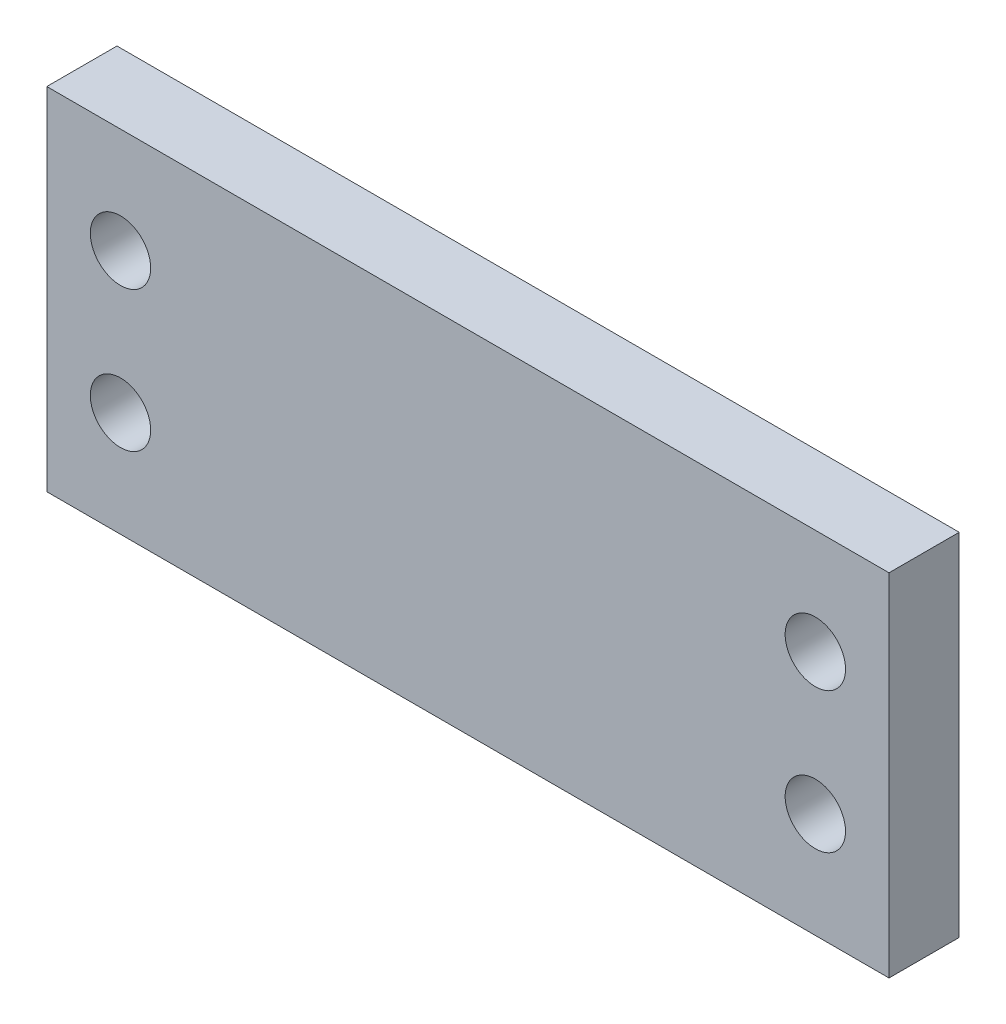
ISO-10303-21;
HEADER;
FILE_DESCRIPTION(('STEP AP214'),'2;1');
FILE_NAME('part.step','',(''),(''),'','','');
FILE_SCHEMA(('AUTOMOTIVE_DESIGN { 1 0 10303 214 1 1 1 1 }'));
ENDSEC;
DATA;
#1=APPLICATION_CONTEXT('core data for automotive mechanical design processes');
#2=APPLICATION_PROTOCOL_DEFINITION('international standard','automotive_design',2000,#1);
#3=PRODUCT_CONTEXT('',#1,'mechanical');
#4=PRODUCT('Part','Part','',(#3));
#5=PRODUCT_RELATED_PRODUCT_CATEGORY('part','',(#4));
#6=PRODUCT_DEFINITION_FORMATION('','',#4);
#7=PRODUCT_DEFINITION_CONTEXT('part definition',#1,'design');
#8=PRODUCT_DEFINITION('design','',#6,#7);
#9=PRODUCT_DEFINITION_SHAPE('','',#8);
#10=(LENGTH_UNIT() NAMED_UNIT(*) SI_UNIT(.MILLI.,.METRE.));
#11=(NAMED_UNIT(*) PLANE_ANGLE_UNIT() SI_UNIT($,.RADIAN.));
#12=(NAMED_UNIT(*) SI_UNIT($,.STERADIAN.) SOLID_ANGLE_UNIT());
#13=UNCERTAINTY_MEASURE_WITH_UNIT(LENGTH_MEASURE(1.E-05),#10,'distance_accuracy_value','');
#14=(GEOMETRIC_REPRESENTATION_CONTEXT(3) GLOBAL_UNCERTAINTY_ASSIGNED_CONTEXT((#13)) GLOBAL_UNIT_ASSIGNED_CONTEXT((#10,
#11,#12)) REPRESENTATION_CONTEXT('',''));
#15=CARTESIAN_POINT('',(0.,0.,0.));
#16=DIRECTION('',(0.,0.,1.));
#17=DIRECTION('',(1.,0.,0.));
#18=AXIS2_PLACEMENT_3D('',#15,#16,#17);
#19=CARTESIAN_POINT('',(30.,12.5,5.));
#20=DIRECTION('',(-1.,0.,0.));
#21=DIRECTION('',(0.,0.,1.));
#22=AXIS2_PLACEMENT_3D('',#19,#20,#21);
#23=PLANE('',#22);
#24=DIRECTION('',(0.,1.,0.));
#25=VECTOR('',#24,1.);
#26=CARTESIAN_POINT('',(30.,12.5,0.));
#27=LINE('',#26,#25);
#28=CARTESIAN_POINT('',(30.,-12.5,0.));
#29=VERTEX_POINT('',#28);
#30=CARTESIAN_POINT('',(30.,12.5,0.));
#31=VERTEX_POINT('',#30);
#32=EDGE_CURVE('E101',#29,#31,#27,.T.);
#33=ORIENTED_EDGE('',*,*,#32,.T.);
#34=DIRECTION('',(0.,0.,-1.));
#35=VECTOR('',#34,1.);
#36=CARTESIAN_POINT('',(30.,12.5,5.));
#37=LINE('',#36,#35);
#38=CARTESIAN_POINT('',(30.,12.5,5.));
#39=VERTEX_POINT('',#38);
#40=EDGE_CURVE('E11',#39,#31,#37,.T.);
#41=ORIENTED_EDGE('',*,*,#40,.F.);
#42=DIRECTION('',(0.,1.,0.));
#43=VECTOR('',#42,1.);
#44=CARTESIAN_POINT('',(30.,12.5,5.));
#45=LINE('',#44,#43);
#46=CARTESIAN_POINT('',(30.,-12.5,5.));
#47=VERTEX_POINT('',#46);
#48=EDGE_CURVE('E88',#47,#39,#45,.T.);
#49=ORIENTED_EDGE('',*,*,#48,.F.);
#50=DIRECTION('',(0.,0.,-1.));
#51=VECTOR('',#50,1.);
#52=CARTESIAN_POINT('',(30.,-12.5,5.));
#53=LINE('',#52,#51);
#54=EDGE_CURVE('E97',#47,#29,#53,.T.);
#55=ORIENTED_EDGE('',*,*,#54,.T.);
#56=EDGE_LOOP('',(#33,#41,#49,#55));
#57=FACE_BOUND('',#56,.T.);
#58=ADVANCED_FACE('F35',(#57),#23,.F.);
#59=CARTESIAN_POINT('',(-30.,12.5,5.));
#60=DIRECTION('',(0.,-1.,0.));
#61=DIRECTION('',(0.,0.,-1.));
#62=AXIS2_PLACEMENT_3D('',#59,#60,#61);
#63=PLANE('',#62);
#64=DIRECTION('',(-1.,0.,0.));
#65=VECTOR('',#64,1.);
#66=CARTESIAN_POINT('',(-30.,12.5,0.));
#67=LINE('',#66,#65);
#68=CARTESIAN_POINT('',(-30.,12.5,0.));
#69=VERTEX_POINT('',#68);
#70=EDGE_CURVE('E92',#31,#69,#67,.T.);
#71=ORIENTED_EDGE('',*,*,#70,.T.);
#72=DIRECTION('',(0.,0.,-1.));
#73=VECTOR('',#72,1.);
#74=CARTESIAN_POINT('',(-30.,12.5,5.));
#75=LINE('',#74,#73);
#76=CARTESIAN_POINT('',(-30.,12.5,5.));
#77=VERTEX_POINT('',#76);
#78=EDGE_CURVE('E44',#77,#69,#75,.T.);
#79=ORIENTED_EDGE('',*,*,#78,.F.);
#80=DIRECTION('',(-1.,0.,0.));
#81=VECTOR('',#80,1.);
#82=CARTESIAN_POINT('',(-30.,12.5,5.));
#83=LINE('',#82,#81);
#84=EDGE_CURVE('E83',#39,#77,#83,.T.);
#85=ORIENTED_EDGE('',*,*,#84,.F.);
#86=ORIENTED_EDGE('',*,*,#40,.T.);
#87=EDGE_LOOP('',(#71,#79,#85,#86));
#88=FACE_BOUND('',#87,.T.);
#89=ADVANCED_FACE('F91',(#88),#63,.F.);
#90=CARTESIAN_POINT('',(-30.,12.5,5.));
#91=DIRECTION('',(1.,0.,0.));
#92=DIRECTION('',(0.,1.,0.));
#93=AXIS2_PLACEMENT_3D('',#90,#91,#92);
#94=PLANE('',#93);
#95=DIRECTION('',(0.,-1.,0.));
#96=VECTOR('',#95,1.);
#97=CARTESIAN_POINT('',(-30.,12.5,0.));
#98=LINE('',#97,#96);
#99=CARTESIAN_POINT('',(-30.,-12.5,0.));
#100=VERTEX_POINT('',#99);
#101=EDGE_CURVE('E70',#69,#100,#98,.T.);
#102=ORIENTED_EDGE('',*,*,#101,.T.);
#103=DIRECTION('',(0.,0.,-1.));
#104=VECTOR('',#103,1.);
#105=CARTESIAN_POINT('',(-30.,-12.5,5.));
#106=LINE('',#105,#104);
#107=CARTESIAN_POINT('',(-30.,-12.5,5.));
#108=VERTEX_POINT('',#107);
#109=EDGE_CURVE('E93',#108,#100,#106,.T.);
#110=ORIENTED_EDGE('',*,*,#109,.F.);
#111=DIRECTION('',(0.,-1.,0.));
#112=VECTOR('',#111,1.);
#113=CARTESIAN_POINT('',(-30.,12.5,5.));
#114=LINE('',#113,#112);
#115=EDGE_CURVE('E86',#77,#108,#114,.T.);
#116=ORIENTED_EDGE('',*,*,#115,.F.);
#117=ORIENTED_EDGE('',*,*,#78,.T.);
#118=EDGE_LOOP('',(#102,#110,#116,#117));
#119=FACE_BOUND('',#118,.T.);
#120=ADVANCED_FACE('F95',(#119),#94,.F.);
#121=CARTESIAN_POINT('',(-30.,-12.5,5.));
#122=DIRECTION('',(0.,1.,0.));
#123=DIRECTION('',(0.,0.,1.));
#124=AXIS2_PLACEMENT_3D('',#121,#122,#123);
#125=PLANE('',#124);
#126=DIRECTION('',(1.,0.,0.));
#127=VECTOR('',#126,1.);
#128=CARTESIAN_POINT('',(-30.,-12.5,0.));
#129=LINE('',#128,#127);
#130=EDGE_CURVE('E76',#100,#29,#129,.T.);
#131=ORIENTED_EDGE('',*,*,#130,.T.);
#132=ORIENTED_EDGE('',*,*,#54,.F.);
#133=DIRECTION('',(1.,0.,0.));
#134=VECTOR('',#133,1.);
#135=CARTESIAN_POINT('',(-30.,-12.5,5.));
#136=LINE('',#135,#134);
#137=EDGE_CURVE('E53',#108,#47,#136,.T.);
#138=ORIENTED_EDGE('',*,*,#137,.F.);
#139=ORIENTED_EDGE('',*,*,#109,.T.);
#140=EDGE_LOOP('',(#131,#132,#138,#139));
#141=FACE_BOUND('',#140,.T.);
#142=ADVANCED_FACE('F153',(#141),#125,.F.);
#143=CARTESIAN_POINT('',(0.,0.,5.));
#144=DIRECTION('',(0.,0.,1.));
#145=DIRECTION('',(1.,0.,0.));
#146=AXIS2_PLACEMENT_3D('',#143,#144,#145);
#147=PLANE('',#146);
#148=CARTESIAN_POINT('',(-24.75,-4.99999999999999,5.));
#149=DIRECTION('',(0.,0.,1.));
#150=DIRECTION('',(1.,0.,0.));
#151=AXIS2_PLACEMENT_3D('',#148,#149,#150);
#152=CIRCLE('',#151,2.14999999999858);
#153=CARTESIAN_POINT('',(-22.6000000000014,-4.99999999999999,5.));
#154=VERTEX_POINT('',#153);
#155=EDGE_CURVE('E217',#154,#154,#152,.T.);
#156=ORIENTED_EDGE('',*,*,#155,.F.);
#157=EDGE_LOOP('',(#156));
#158=FACE_BOUND('',#157,.T.);
#159=CARTESIAN_POINT('',(24.75,5.00000000000001,5.));
#160=DIRECTION('',(0.,0.,1.));
#161=DIRECTION('',(1.,0.,0.));
#162=AXIS2_PLACEMENT_3D('',#159,#160,#161);
#163=CIRCLE('',#162,2.14999999999858);
#164=CARTESIAN_POINT('',(26.8999999999986,5.00000000000001,5.));
#165=VERTEX_POINT('',#164);
#166=EDGE_CURVE('E214',#165,#165,#163,.T.);
#167=ORIENTED_EDGE('',*,*,#166,.F.);
#168=EDGE_LOOP('',(#167));
#169=FACE_BOUND('',#168,.T.);
#170=CARTESIAN_POINT('',(24.75,-4.99999999999999,5.));
#171=DIRECTION('',(0.,0.,1.));
#172=DIRECTION('',(1.,0.,0.));
#173=AXIS2_PLACEMENT_3D('',#170,#171,#172);
#174=CIRCLE('',#173,2.14999999999858);
#175=CARTESIAN_POINT('',(26.8999999999986,-4.99999999999999,5.));
#176=VERTEX_POINT('',#175);
#177=EDGE_CURVE('E207',#176,#176,#174,.T.);
#178=ORIENTED_EDGE('',*,*,#177,.F.);
#179=EDGE_LOOP('',(#178));
#180=FACE_BOUND('',#179,.T.);
#181=CARTESIAN_POINT('',(-24.75,5.00000000000001,5.));
#182=DIRECTION('',(0.,0.,1.));
#183=DIRECTION('',(1.,0.,0.));
#184=AXIS2_PLACEMENT_3D('',#181,#182,#183);
#185=CIRCLE('',#184,2.14999999999823);
#186=CARTESIAN_POINT('',(-22.6000000000018,5.00000000000001,5.));
#187=VERTEX_POINT('',#186);
#188=EDGE_CURVE('E113',#187,#187,#185,.T.);
#189=ORIENTED_EDGE('',*,*,#188,.F.);
#190=EDGE_LOOP('',(#189));
#191=FACE_BOUND('',#190,.T.);
#192=ORIENTED_EDGE('',*,*,#48,.T.);
#193=ORIENTED_EDGE('',*,*,#84,.T.);
#194=ORIENTED_EDGE('',*,*,#115,.T.);
#195=ORIENTED_EDGE('',*,*,#137,.T.);
#196=EDGE_LOOP('',(#192,#193,#194,#195));
#197=FACE_BOUND('',#196,.T.);
#198=ADVANCED_FACE('F84',(#158,#169,#180,#191,#197),#147,.T.);
#199=CARTESIAN_POINT('',(0.,0.,0.));
#200=DIRECTION('',(0.,0.,1.));
#201=DIRECTION('',(1.,0.,0.));
#202=AXIS2_PLACEMENT_3D('',#199,#200,#201);
#203=PLANE('',#202);
#204=CARTESIAN_POINT('',(-24.75,-4.99999999999999,0.));
#205=DIRECTION('',(0.,0.,1.));
#206=DIRECTION('',(1.,0.,0.));
#207=AXIS2_PLACEMENT_3D('',#204,#205,#206);
#208=CIRCLE('',#207,2.14999999999858);
#209=CARTESIAN_POINT('',(-22.6000000000014,-4.99999999999999,0.));
#210=VERTEX_POINT('',#209);
#211=EDGE_CURVE('E38',#210,#210,#208,.T.);
#212=ORIENTED_EDGE('',*,*,#211,.T.);
#213=EDGE_LOOP('',(#212));
#214=FACE_BOUND('',#213,.T.);
#215=CARTESIAN_POINT('',(24.75,5.00000000000001,0.));
#216=DIRECTION('',(0.,0.,1.));
#217=DIRECTION('',(1.,0.,0.));
#218=AXIS2_PLACEMENT_3D('',#215,#216,#217);
#219=CIRCLE('',#218,2.14999999999858);
#220=CARTESIAN_POINT('',(26.8999999999986,5.00000000000001,0.));
#221=VERTEX_POINT('',#220);
#222=EDGE_CURVE('E115',#221,#221,#219,.T.);
#223=ORIENTED_EDGE('',*,*,#222,.T.);
#224=EDGE_LOOP('',(#223));
#225=FACE_BOUND('',#224,.T.);
#226=CARTESIAN_POINT('',(24.75,-4.99999999999999,0.));
#227=DIRECTION('',(0.,0.,1.));
#228=DIRECTION('',(1.,0.,0.));
#229=AXIS2_PLACEMENT_3D('',#226,#227,#228);
#230=CIRCLE('',#229,2.14999999999858);
#231=CARTESIAN_POINT('',(26.8999999999986,-4.99999999999999,0.));
#232=VERTEX_POINT('',#231);
#233=EDGE_CURVE('E112',#232,#232,#230,.T.);
#234=ORIENTED_EDGE('',*,*,#233,.T.);
#235=EDGE_LOOP('',(#234));
#236=FACE_BOUND('',#235,.T.);
#237=CARTESIAN_POINT('',(-24.75,5.00000000000001,0.));
#238=DIRECTION('',(0.,0.,1.));
#239=DIRECTION('',(1.,0.,0.));
#240=AXIS2_PLACEMENT_3D('',#237,#238,#239);
#241=CIRCLE('',#240,2.14999999999823);
#242=CARTESIAN_POINT('',(-22.6000000000018,5.00000000000001,0.));
#243=VERTEX_POINT('',#242);
#244=EDGE_CURVE('E109',#243,#243,#241,.T.);
#245=ORIENTED_EDGE('',*,*,#244,.T.);
#246=EDGE_LOOP('',(#245));
#247=FACE_BOUND('',#246,.T.);
#248=ORIENTED_EDGE('',*,*,#32,.F.);
#249=ORIENTED_EDGE('',*,*,#130,.F.);
#250=ORIENTED_EDGE('',*,*,#101,.F.);
#251=ORIENTED_EDGE('',*,*,#70,.F.);
#252=EDGE_LOOP('',(#248,#249,#250,#251));
#253=FACE_BOUND('',#252,.T.);
#254=ADVANCED_FACE('F122',(#214,#225,#236,#247,#253),#203,.F.);
#255=CARTESIAN_POINT('',(-24.75,5.00000000000001,-45.));
#256=DIRECTION('',(0.,0.,1.));
#257=DIRECTION('',(1.,0.,0.));
#258=AXIS2_PLACEMENT_3D('',#255,#256,#257);
#259=CYLINDRICAL_SURFACE('',#258,2.14999999999823);
#260=ORIENTED_EDGE('',*,*,#188,.T.);
#261=EDGE_LOOP('',(#260));
#262=FACE_BOUND('',#261,.T.);
#263=ORIENTED_EDGE('',*,*,#244,.F.);
#264=EDGE_LOOP('',(#263));
#265=FACE_BOUND('',#264,.T.);
#266=ADVANCED_FACE('F145',(#262,#265),#259,.F.);
#267=CARTESIAN_POINT('',(24.75,-4.99999999999999,-45.));
#268=DIRECTION('',(0.,0.,1.));
#269=DIRECTION('',(1.,0.,0.));
#270=AXIS2_PLACEMENT_3D('',#267,#268,#269);
#271=CYLINDRICAL_SURFACE('',#270,2.14999999999858);
#272=ORIENTED_EDGE('',*,*,#177,.T.);
#273=EDGE_LOOP('',(#272));
#274=FACE_BOUND('',#273,.T.);
#275=ORIENTED_EDGE('',*,*,#233,.F.);
#276=EDGE_LOOP('',(#275));
#277=FACE_BOUND('',#276,.T.);
#278=ADVANCED_FACE('F132',(#274,#277),#271,.F.);
#279=CARTESIAN_POINT('',(24.75,5.00000000000001,-45.));
#280=DIRECTION('',(0.,0.,1.));
#281=DIRECTION('',(1.,0.,0.));
#282=AXIS2_PLACEMENT_3D('',#279,#280,#281);
#283=CYLINDRICAL_SURFACE('',#282,2.14999999999858);
#284=ORIENTED_EDGE('',*,*,#166,.T.);
#285=EDGE_LOOP('',(#284));
#286=FACE_BOUND('',#285,.T.);
#287=ORIENTED_EDGE('',*,*,#222,.F.);
#288=EDGE_LOOP('',(#287));
#289=FACE_BOUND('',#288,.T.);
#290=ADVANCED_FACE('F126',(#286,#289),#283,.F.);
#291=CARTESIAN_POINT('',(-24.75,-4.99999999999999,-45.));
#292=DIRECTION('',(0.,0.,1.));
#293=DIRECTION('',(1.,0.,0.));
#294=AXIS2_PLACEMENT_3D('',#291,#292,#293);
#295=CYLINDRICAL_SURFACE('',#294,2.14999999999858);
#296=ORIENTED_EDGE('',*,*,#155,.T.);
#297=EDGE_LOOP('',(#296));
#298=FACE_BOUND('',#297,.T.);
#299=ORIENTED_EDGE('',*,*,#211,.F.);
#300=EDGE_LOOP('',(#299));
#301=FACE_BOUND('',#300,.T.);
#302=ADVANCED_FACE('F124',(#298,#301),#295,.F.);
#303=CLOSED_SHELL('',(#58,#89,#120,#142,#198,#254,#266,#278,#290,#302));
#304=MANIFOLD_SOLID_BREP('B2',#303);
#305=ADVANCED_BREP_SHAPE_REPRESENTATION('',(#18,#304),#14);
#306=SHAPE_DEFINITION_REPRESENTATION(#9,#305);
ENDSEC;
END-ISO-10303-21;
